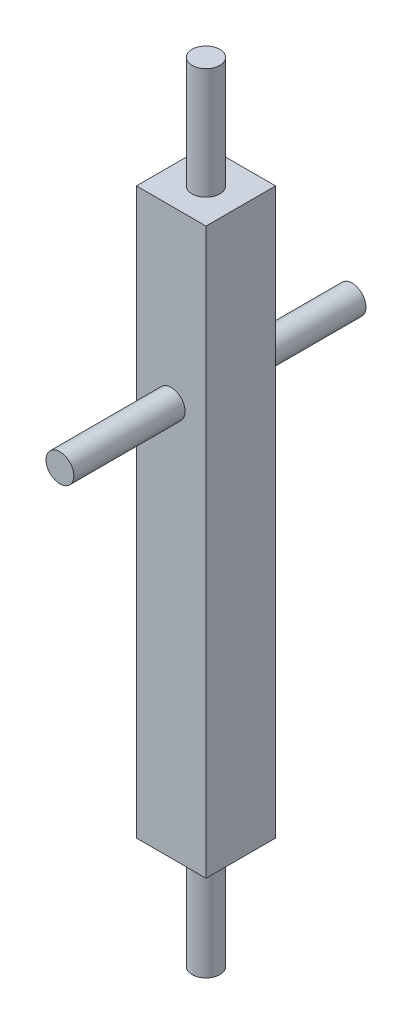
ISO-10303-21;
HEADER;
FILE_DESCRIPTION(('STEP AP214'),'2;1');
FILE_NAME('part.step','',(''),(''),'','','');
FILE_SCHEMA(('AUTOMOTIVE_DESIGN { 1 0 10303 214 1 1 1 1 }'));
ENDSEC;
DATA;
#1=APPLICATION_CONTEXT('core data for automotive mechanical design processes');
#2=APPLICATION_PROTOCOL_DEFINITION('international standard','automotive_design',2000,#1);
#3=PRODUCT_CONTEXT('',#1,'mechanical');
#4=PRODUCT('Part','Part','',(#3));
#5=PRODUCT_RELATED_PRODUCT_CATEGORY('part','',(#4));
#6=PRODUCT_DEFINITION_FORMATION('','',#4);
#7=PRODUCT_DEFINITION_CONTEXT('part definition',#1,'design');
#8=PRODUCT_DEFINITION('design','',#6,#7);
#9=PRODUCT_DEFINITION_SHAPE('','',#8);
#10=(LENGTH_UNIT() NAMED_UNIT(*) SI_UNIT(.MILLI.,.METRE.));
#11=(NAMED_UNIT(*) PLANE_ANGLE_UNIT() SI_UNIT($,.RADIAN.));
#12=(NAMED_UNIT(*) SI_UNIT($,.STERADIAN.) SOLID_ANGLE_UNIT());
#13=UNCERTAINTY_MEASURE_WITH_UNIT(LENGTH_MEASURE(1.E-05),#10,'distance_accuracy_value','');
#14=(GEOMETRIC_REPRESENTATION_CONTEXT(3) GLOBAL_UNCERTAINTY_ASSIGNED_CONTEXT((#13)) GLOBAL_UNIT_ASSIGNED_CONTEXT((#10,
#11,#12)) REPRESENTATION_CONTEXT('',''));
#15=CARTESIAN_POINT('',(0.,0.,0.));
#16=DIRECTION('',(0.,0.,1.));
#17=DIRECTION('',(1.,0.,0.));
#18=AXIS2_PLACEMENT_3D('',#15,#16,#17);
#19=CARTESIAN_POINT('',(12.5,200.,-12.5));
#20=DIRECTION('',(-1.,0.,0.));
#21=DIRECTION('',(0.,0.,1.));
#22=AXIS2_PLACEMENT_3D('',#19,#20,#21);
#23=PLANE('',#22);
#24=DIRECTION('',(0.,-1.,0.));
#25=VECTOR('',#24,1.);
#26=CARTESIAN_POINT('',(12.5,200.,12.5));
#27=LINE('',#26,#25);
#28=CARTESIAN_POINT('',(12.5,201.5,12.5));
#29=VERTEX_POINT('',#28);
#30=CARTESIAN_POINT('',(12.5,-1.5,12.5));
#31=VERTEX_POINT('',#30);
#32=EDGE_CURVE('E102',#29,#31,#27,.T.);
#33=ORIENTED_EDGE('',*,*,#32,.T.);
#34=DIRECTION('',(0.,0.,1.));
#35=VECTOR('',#34,1.);
#36=CARTESIAN_POINT('',(12.5,-1.5,12.5));
#37=LINE('',#36,#35);
#38=CARTESIAN_POINT('',(12.5,-1.5,-12.5));
#39=VERTEX_POINT('',#38);
#40=EDGE_CURVE('E105',#39,#31,#37,.T.);
#41=ORIENTED_EDGE('',*,*,#40,.F.);
#42=DIRECTION('',(0.,-1.,0.));
#43=VECTOR('',#42,1.);
#44=CARTESIAN_POINT('',(12.5,200.,-12.5));
#45=LINE('',#44,#43);
#46=CARTESIAN_POINT('',(12.5,201.5,-12.5));
#47=VERTEX_POINT('',#46);
#48=EDGE_CURVE('E189',#47,#39,#45,.T.);
#49=ORIENTED_EDGE('',*,*,#48,.F.);
#50=DIRECTION('',(0.,0.,-1.));
#51=VECTOR('',#50,1.);
#52=CARTESIAN_POINT('',(12.5,201.5,-12.5));
#53=LINE('',#52,#51);
#54=EDGE_CURVE('E107',#29,#47,#53,.T.);
#55=ORIENTED_EDGE('',*,*,#54,.F.);
#56=EDGE_LOOP('',(#33,#41,#49,#55));
#57=FACE_BOUND('',#56,.T.);
#58=ADVANCED_FACE('F34',(#57),#23,.F.);
#59=CARTESIAN_POINT('',(-12.5,200.,-12.5));
#60=DIRECTION('',(0.,0.,1.));
#61=DIRECTION('',(1.,0.,0.));
#62=AXIS2_PLACEMENT_3D('',#59,#60,#61);
#63=PLANE('',#62);
#64=CARTESIAN_POINT('',(0.,140.,-12.5));
#65=DIRECTION('',(0.,0.,1.));
#66=DIRECTION('',(1.,0.,0.));
#67=AXIS2_PLACEMENT_3D('',#64,#65,#66);
#68=CIRCLE('',#67,5.00000000000001);
#69=CARTESIAN_POINT('',(5.00000000000001,140.,-12.5));
#70=VERTEX_POINT('',#69);
#71=EDGE_CURVE('E150',#70,#70,#68,.T.);
#72=ORIENTED_EDGE('',*,*,#71,.T.);
#73=EDGE_LOOP('',(#72));
#74=FACE_BOUND('',#73,.T.);
#75=ORIENTED_EDGE('',*,*,#48,.T.);
#76=DIRECTION('',(1.,0.,0.));
#77=VECTOR('',#76,1.);
#78=CARTESIAN_POINT('',(-12.5,-1.5,-12.5));
#79=LINE('',#78,#77);
#80=CARTESIAN_POINT('',(-12.5,-1.5,-12.5));
#81=VERTEX_POINT('',#80);
#82=EDGE_CURVE('E125',#81,#39,#79,.T.);
#83=ORIENTED_EDGE('',*,*,#82,.F.);
#84=DIRECTION('',(0.,-1.,0.));
#85=VECTOR('',#84,1.);
#86=CARTESIAN_POINT('',(-12.5,200.,-12.5));
#87=LINE('',#86,#85);
#88=CARTESIAN_POINT('',(-12.5,201.5,-12.5));
#89=VERTEX_POINT('',#88);
#90=EDGE_CURVE('E188',#89,#81,#87,.T.);
#91=ORIENTED_EDGE('',*,*,#90,.F.);
#92=DIRECTION('',(-1.,0.,0.));
#93=VECTOR('',#92,1.);
#94=CARTESIAN_POINT('',(-12.5,201.5,-12.5));
#95=LINE('',#94,#93);
#96=EDGE_CURVE('E136',#47,#89,#95,.T.);
#97=ORIENTED_EDGE('',*,*,#96,.F.);
#98=EDGE_LOOP('',(#75,#83,#91,#97));
#99=FACE_BOUND('',#98,.T.);
#100=ADVANCED_FACE('F212',(#74,#99),#63,.F.);
#101=CARTESIAN_POINT('',(-12.5,200.,-12.5));
#102=DIRECTION('',(1.,0.,0.));
#103=DIRECTION('',(0.,0.,-1.));
#104=AXIS2_PLACEMENT_3D('',#101,#102,#103);
#105=PLANE('',#104);
#106=ORIENTED_EDGE('',*,*,#90,.T.);
#107=DIRECTION('',(0.,0.,-1.));
#108=VECTOR('',#107,1.);
#109=CARTESIAN_POINT('',(-12.5,-1.5,12.5));
#110=LINE('',#109,#108);
#111=CARTESIAN_POINT('',(-12.5,-1.5,12.5));
#112=VERTEX_POINT('',#111);
#113=EDGE_CURVE('E120',#112,#81,#110,.T.);
#114=ORIENTED_EDGE('',*,*,#113,.F.);
#115=DIRECTION('',(0.,-1.,0.));
#116=VECTOR('',#115,1.);
#117=CARTESIAN_POINT('',(-12.5,200.,12.5));
#118=LINE('',#117,#116);
#119=CARTESIAN_POINT('',(-12.5,201.5,12.5));
#120=VERTEX_POINT('',#119);
#121=EDGE_CURVE('E111',#120,#112,#118,.T.);
#122=ORIENTED_EDGE('',*,*,#121,.F.);
#123=DIRECTION('',(0.,0.,1.));
#124=VECTOR('',#123,1.);
#125=CARTESIAN_POINT('',(-12.5,201.5,-12.5));
#126=LINE('',#125,#124);
#127=EDGE_CURVE('E139',#89,#120,#126,.T.);
#128=ORIENTED_EDGE('',*,*,#127,.F.);
#129=EDGE_LOOP('',(#106,#114,#122,#128));
#130=FACE_BOUND('',#129,.T.);
#131=ADVANCED_FACE('F217',(#130),#105,.F.);
#132=CARTESIAN_POINT('',(-12.5,200.,12.5));
#133=DIRECTION('',(0.,0.,-1.));
#134=DIRECTION('',(-1.,0.,0.));
#135=AXIS2_PLACEMENT_3D('',#132,#133,#134);
#136=PLANE('',#135);
#137=CARTESIAN_POINT('',(0.,140.,12.5));
#138=DIRECTION('',(0.,0.,1.));
#139=DIRECTION('',(1.,0.,0.));
#140=AXIS2_PLACEMENT_3D('',#137,#138,#139);
#141=CIRCLE('',#140,5.);
#142=CARTESIAN_POINT('',(5.,140.,12.5));
#143=VERTEX_POINT('',#142);
#144=EDGE_CURVE('E153',#143,#143,#141,.T.);
#145=ORIENTED_EDGE('',*,*,#144,.F.);
#146=EDGE_LOOP('',(#145));
#147=FACE_BOUND('',#146,.T.);
#148=ORIENTED_EDGE('',*,*,#121,.T.);
#149=DIRECTION('',(-1.,0.,0.));
#150=VECTOR('',#149,1.);
#151=CARTESIAN_POINT('',(-12.5,-1.5,12.5));
#152=LINE('',#151,#150);
#153=EDGE_CURVE('E115',#31,#112,#152,.T.);
#154=ORIENTED_EDGE('',*,*,#153,.F.);
#155=ORIENTED_EDGE('',*,*,#32,.F.);
#156=DIRECTION('',(1.,0.,0.));
#157=VECTOR('',#156,1.);
#158=CARTESIAN_POINT('',(-12.5,201.5,12.5));
#159=LINE('',#158,#157);
#160=EDGE_CURVE('E142',#120,#29,#159,.T.);
#161=ORIENTED_EDGE('',*,*,#160,.F.);
#162=EDGE_LOOP('',(#148,#154,#155,#161));
#163=FACE_BOUND('',#162,.T.);
#164=ADVANCED_FACE('F116',(#147,#163),#136,.F.);
#165=CARTESIAN_POINT('',(0.,140.,52.5));
#166=DIRECTION('',(0.,0.,1.));
#167=DIRECTION('',(1.,0.,0.));
#168=AXIS2_PLACEMENT_3D('',#165,#166,#167);
#169=PLANE('',#168);
#170=CARTESIAN_POINT('',(0.,140.,52.5));
#171=DIRECTION('',(0.,0.,1.));
#172=DIRECTION('',(1.,0.,0.));
#173=AXIS2_PLACEMENT_3D('',#170,#171,#172);
#174=CIRCLE('',#173,5.00000000000001);
#175=CARTESIAN_POINT('',(5.00000000000001,140.,52.5));
#176=VERTEX_POINT('',#175);
#177=EDGE_CURVE('E144',#176,#176,#174,.T.);
#178=ORIENTED_EDGE('',*,*,#177,.T.);
#179=EDGE_LOOP('',(#178));
#180=FACE_BOUND('',#179,.T.);
#181=ADVANCED_FACE('F227',(#180),#169,.T.);
#182=CARTESIAN_POINT('',(0.,140.,-52.5));
#183=DIRECTION('',(0.,0.,1.));
#184=DIRECTION('',(1.,0.,0.));
#185=AXIS2_PLACEMENT_3D('',#182,#183,#184);
#186=CYLINDRICAL_SURFACE('',#185,5.00000000000001);
#187=ORIENTED_EDGE('',*,*,#177,.F.);
#188=EDGE_LOOP('',(#187));
#189=FACE_BOUND('',#188,.T.);
#190=ORIENTED_EDGE('',*,*,#144,.T.);
#191=EDGE_LOOP('',(#190));
#192=FACE_BOUND('',#191,.T.);
#193=ADVANCED_FACE('F251',(#189,#192),#186,.T.);
#194=CARTESIAN_POINT('',(0.,140.,-52.5));
#195=DIRECTION('',(0.,0.,1.));
#196=DIRECTION('',(1.,0.,0.));
#197=AXIS2_PLACEMENT_3D('',#194,#195,#196);
#198=CIRCLE('',#197,5.00000000000001);
#199=CARTESIAN_POINT('',(5.00000000000001,140.,-52.5));
#200=VERTEX_POINT('',#199);
#201=EDGE_CURVE('E147',#200,#200,#198,.T.);
#202=ORIENTED_EDGE('',*,*,#201,.T.);
#203=EDGE_LOOP('',(#202));
#204=FACE_BOUND('',#203,.T.);
#205=ORIENTED_EDGE('',*,*,#71,.F.);
#206=EDGE_LOOP('',(#205));
#207=FACE_BOUND('',#206,.T.);
#208=ADVANCED_FACE('F250',(#204,#207),#186,.T.);
#209=CARTESIAN_POINT('',(0.,140.,-52.5));
#210=DIRECTION('',(0.,0.,1.));
#211=DIRECTION('',(1.,0.,0.));
#212=AXIS2_PLACEMENT_3D('',#209,#210,#211);
#213=PLANE('',#212);
#214=ORIENTED_EDGE('',*,*,#201,.F.);
#215=EDGE_LOOP('',(#214));
#216=FACE_BOUND('',#215,.T.);
#217=ADVANCED_FACE('F207',(#216),#213,.F.);
#218=CARTESIAN_POINT('',(0.,201.5,0.));
#219=DIRECTION('',(0.,1.,0.));
#220=DIRECTION('',(0.,0.,1.));
#221=AXIS2_PLACEMENT_3D('',#218,#219,#220);
#222=PLANE('',#221);
#223=CARTESIAN_POINT('',(0.,201.5,0.));
#224=DIRECTION('',(0.,1.,0.));
#225=DIRECTION('',(0.,0.,1.));
#226=AXIS2_PLACEMENT_3D('',#223,#224,#225);
#227=CIRCLE('',#226,5.);
#228=CARTESIAN_POINT('',(0.,201.5,5.));
#229=VERTEX_POINT('',#228);
#230=EDGE_CURVE('E11',#229,#229,#227,.T.);
#231=ORIENTED_EDGE('',*,*,#230,.F.);
#232=EDGE_LOOP('',(#231));
#233=FACE_BOUND('',#232,.T.);
#234=ORIENTED_EDGE('',*,*,#54,.T.);
#235=ORIENTED_EDGE('',*,*,#96,.T.);
#236=ORIENTED_EDGE('',*,*,#127,.T.);
#237=ORIENTED_EDGE('',*,*,#160,.T.);
#238=EDGE_LOOP('',(#234,#235,#236,#237));
#239=FACE_BOUND('',#238,.T.);
#240=ADVANCED_FACE('F198',(#233,#239),#222,.T.);
#241=CARTESIAN_POINT('',(0.,-1.5,0.));
#242=DIRECTION('',(0.,-1.,0.));
#243=DIRECTION('',(0.,0.,-1.));
#244=AXIS2_PLACEMENT_3D('',#241,#242,#243);
#245=PLANE('',#244);
#246=CARTESIAN_POINT('',(0.,-1.5,0.));
#247=DIRECTION('',(0.,-1.,0.));
#248=DIRECTION('',(0.,0.,-1.));
#249=AXIS2_PLACEMENT_3D('',#246,#247,#248);
#250=CIRCLE('',#249,5.);
#251=CARTESIAN_POINT('',(0.,-1.5,-5.));
#252=VERTEX_POINT('',#251);
#253=EDGE_CURVE('E43',#252,#252,#250,.T.);
#254=ORIENTED_EDGE('',*,*,#253,.F.);
#255=EDGE_LOOP('',(#254));
#256=FACE_BOUND('',#255,.T.);
#257=ORIENTED_EDGE('',*,*,#40,.T.);
#258=ORIENTED_EDGE('',*,*,#153,.T.);
#259=ORIENTED_EDGE('',*,*,#113,.T.);
#260=ORIENTED_EDGE('',*,*,#82,.T.);
#261=EDGE_LOOP('',(#257,#258,#259,#260));
#262=FACE_BOUND('',#261,.T.);
#263=ADVANCED_FACE('F123',(#256,#262),#245,.T.);
#264=CARTESIAN_POINT('',(0.,-41.5,0.));
#265=DIRECTION('',(0.,1.,0.));
#266=DIRECTION('',(0.,0.,1.));
#267=AXIS2_PLACEMENT_3D('',#264,#265,#266);
#268=CYLINDRICAL_SURFACE('',#267,5.);
#269=CARTESIAN_POINT('',(0.,-41.5,0.));
#270=DIRECTION('',(0.,-1.,0.));
#271=DIRECTION('',(0.,0.,-1.));
#272=AXIS2_PLACEMENT_3D('',#269,#270,#271);
#273=CIRCLE('',#272,5.);
#274=CARTESIAN_POINT('',(0.,-41.5,-5.));
#275=VERTEX_POINT('',#274);
#276=EDGE_CURVE('E126',#275,#275,#273,.T.);
#277=ORIENTED_EDGE('',*,*,#276,.F.);
#278=EDGE_LOOP('',(#277));
#279=FACE_BOUND('',#278,.T.);
#280=ORIENTED_EDGE('',*,*,#253,.T.);
#281=EDGE_LOOP('',(#280));
#282=FACE_BOUND('',#281,.T.);
#283=ADVANCED_FACE('F195',(#279,#282),#268,.T.);
#284=CARTESIAN_POINT('',(0.,-41.5,0.));
#285=DIRECTION('',(0.,-1.,0.));
#286=DIRECTION('',(0.,0.,-1.));
#287=AXIS2_PLACEMENT_3D('',#284,#285,#286);
#288=PLANE('',#287);
#289=ORIENTED_EDGE('',*,*,#276,.T.);
#290=EDGE_LOOP('',(#289));
#291=FACE_BOUND('',#290,.T.);
#292=ADVANCED_FACE('F204',(#291),#288,.T.);
#293=CARTESIAN_POINT('',(0.,241.5,0.));
#294=DIRECTION('',(0.,-1.,0.));
#295=DIRECTION('',(0.,0.,-1.));
#296=AXIS2_PLACEMENT_3D('',#293,#294,#295);
#297=CYLINDRICAL_SURFACE('',#296,5.);
#298=CARTESIAN_POINT('',(0.,241.5,0.));
#299=DIRECTION('',(0.,1.,0.));
#300=DIRECTION('',(0.,0.,1.));
#301=AXIS2_PLACEMENT_3D('',#298,#299,#300);
#302=CIRCLE('',#301,5.);
#303=CARTESIAN_POINT('',(0.,241.5,5.));
#304=VERTEX_POINT('',#303);
#305=EDGE_CURVE('E129',#304,#304,#302,.T.);
#306=ORIENTED_EDGE('',*,*,#305,.F.);
#307=EDGE_LOOP('',(#306));
#308=FACE_BOUND('',#307,.T.);
#309=ORIENTED_EDGE('',*,*,#230,.T.);
#310=EDGE_LOOP('',(#309));
#311=FACE_BOUND('',#310,.T.);
#312=ADVANCED_FACE('F323',(#308,#311),#297,.T.);
#313=CARTESIAN_POINT('',(0.,241.5,0.));
#314=DIRECTION('',(0.,1.,0.));
#315=DIRECTION('',(0.,0.,1.));
#316=AXIS2_PLACEMENT_3D('',#313,#314,#315);
#317=PLANE('',#316);
#318=ORIENTED_EDGE('',*,*,#305,.T.);
#319=EDGE_LOOP('',(#318));
#320=FACE_BOUND('',#319,.T.);
#321=ADVANCED_FACE('F273',(#320),#317,.T.);
#322=CLOSED_SHELL('',(#58,#100,#131,#164,#181,#193,#208,#217,#240,#263,#283,#292,#312,#321));
#323=CARTESIAN_POINT('',(0.,0.,0.));
#324=DIRECTION('',(0.,-1.,0.));
#325=DIRECTION('',(0.,0.,-1.));
#326=AXIS2_PLACEMENT_3D('',#323,#324,#325);
#327=PLANE('',#326);
#328=DIRECTION('',(1.,0.,0.));
#329=VECTOR('',#328,1.);
#330=CARTESIAN_POINT('',(-11.,0.,11.));
#331=LINE('',#330,#329);
#332=CARTESIAN_POINT('',(-11.,0.,11.));
#333=VERTEX_POINT('',#332);
#334=CARTESIAN_POINT('',(11.,0.,11.));
#335=VERTEX_POINT('',#334);
#336=EDGE_CURVE('E164',#333,#335,#331,.T.);
#337=ORIENTED_EDGE('',*,*,#336,.T.);
#338=DIRECTION('',(0.,0.,-1.));
#339=VECTOR('',#338,1.);
#340=CARTESIAN_POINT('',(11.,0.,-11.));
#341=LINE('',#340,#339);
#342=CARTESIAN_POINT('',(11.,0.,-11.));
#343=VERTEX_POINT('',#342);
#344=EDGE_CURVE('E159',#335,#343,#341,.T.);
#345=ORIENTED_EDGE('',*,*,#344,.T.);
#346=DIRECTION('',(-1.,0.,0.));
#347=VECTOR('',#346,1.);
#348=CARTESIAN_POINT('',(-11.,0.,-11.));
#349=LINE('',#348,#347);
#350=CARTESIAN_POINT('',(-11.,0.,-11.));
#351=VERTEX_POINT('',#350);
#352=EDGE_CURVE('E173',#343,#351,#349,.T.);
#353=ORIENTED_EDGE('',*,*,#352,.T.);
#354=DIRECTION('',(0.,0.,1.));
#355=VECTOR('',#354,1.);
#356=CARTESIAN_POINT('',(-11.,0.,-11.));
#357=LINE('',#356,#355);
#358=EDGE_CURVE('E176',#351,#333,#357,.T.);
#359=ORIENTED_EDGE('',*,*,#358,.T.);
#360=EDGE_LOOP('',(#337,#345,#353,#359));
#361=FACE_BOUND('',#360,.T.);
#362=ADVANCED_FACE('F258',(#361),#327,.F.);
#363=CARTESIAN_POINT('',(0.,200.,0.));
#364=DIRECTION('',(0.,1.,0.));
#365=DIRECTION('',(0.,0.,1.));
#366=AXIS2_PLACEMENT_3D('',#363,#364,#365);
#367=PLANE('',#366);
#368=DIRECTION('',(-1.,0.,0.));
#369=VECTOR('',#368,1.);
#370=CARTESIAN_POINT('',(-11.,200.,-11.));
#371=LINE('',#370,#369);
#372=CARTESIAN_POINT('',(11.,200.,-11.));
#373=VERTEX_POINT('',#372);
#374=CARTESIAN_POINT('',(-11.,200.,-11.));
#375=VERTEX_POINT('',#374);
#376=EDGE_CURVE('E163',#373,#375,#371,.T.);
#377=ORIENTED_EDGE('',*,*,#376,.F.);
#378=DIRECTION('',(0.,0.,-1.));
#379=VECTOR('',#378,1.);
#380=CARTESIAN_POINT('',(11.,200.,-11.));
#381=LINE('',#380,#379);
#382=CARTESIAN_POINT('',(11.,200.,11.));
#383=VERTEX_POINT('',#382);
#384=EDGE_CURVE('E160',#383,#373,#381,.T.);
#385=ORIENTED_EDGE('',*,*,#384,.F.);
#386=DIRECTION('',(1.,0.,0.));
#387=VECTOR('',#386,1.);
#388=CARTESIAN_POINT('',(-11.,200.,11.));
#389=LINE('',#388,#387);
#390=CARTESIAN_POINT('',(-11.,200.,11.));
#391=VERTEX_POINT('',#390);
#392=EDGE_CURVE('E51',#391,#383,#389,.T.);
#393=ORIENTED_EDGE('',*,*,#392,.F.);
#394=DIRECTION('',(0.,0.,1.));
#395=VECTOR('',#394,1.);
#396=CARTESIAN_POINT('',(-11.,200.,-11.));
#397=LINE('',#396,#395);
#398=EDGE_CURVE('E167',#375,#391,#397,.T.);
#399=ORIENTED_EDGE('',*,*,#398,.F.);
#400=EDGE_LOOP('',(#377,#385,#393,#399));
#401=FACE_BOUND('',#400,.T.);
#402=ADVANCED_FACE('F248',(#401),#367,.F.);
#403=CARTESIAN_POINT('',(0.,140.,-11.));
#404=DIRECTION('',(0.,0.,1.));
#405=DIRECTION('',(1.,0.,0.));
#406=AXIS2_PLACEMENT_3D('',#403,#404,#405);
#407=CIRCLE('',#406,5.);
#408=CARTESIAN_POINT('',(5.,140.,-11.));
#409=VERTEX_POINT('',#408);
#410=EDGE_CURVE('E156',#409,#409,#407,.T.);
#411=ORIENTED_EDGE('',*,*,#410,.T.);
#412=EDGE_LOOP('',(#411));
#413=FACE_BOUND('',#412,.T.);
#414=CARTESIAN_POINT('',(0.,140.,11.));
#415=DIRECTION('',(0.,0.,-1.));
#416=DIRECTION('',(-1.,0.,0.));
#417=AXIS2_PLACEMENT_3D('',#414,#415,#416);
#418=CIRCLE('',#417,5.);
#419=CARTESIAN_POINT('',(-5.,140.,11.));
#420=VERTEX_POINT('',#419);
#421=EDGE_CURVE('E37',#420,#420,#418,.T.);
#422=ORIENTED_EDGE('',*,*,#421,.T.);
#423=EDGE_LOOP('',(#422));
#424=FACE_BOUND('',#423,.T.);
#425=ADVANCED_FACE('F244',(#413,#424),#186,.T.);
#426=CARTESIAN_POINT('',(-11.,200.,11.));
#427=DIRECTION('',(0.,0.,-1.));
#428=DIRECTION('',(-1.,0.,0.));
#429=AXIS2_PLACEMENT_3D('',#426,#427,#428);
#430=PLANE('',#429);
#431=ORIENTED_EDGE('',*,*,#421,.F.);
#432=EDGE_LOOP('',(#431));
#433=FACE_BOUND('',#432,.T.);
#434=ORIENTED_EDGE('',*,*,#336,.F.);
#435=DIRECTION('',(0.,-1.,0.));
#436=VECTOR('',#435,1.);
#437=CARTESIAN_POINT('',(-11.,200.,11.));
#438=LINE('',#437,#436);
#439=EDGE_CURVE('E58',#391,#333,#438,.T.);
#440=ORIENTED_EDGE('',*,*,#439,.F.);
#441=ORIENTED_EDGE('',*,*,#392,.T.);
#442=DIRECTION('',(0.,-1.,0.));
#443=VECTOR('',#442,1.);
#444=CARTESIAN_POINT('',(11.,200.,11.));
#445=LINE('',#444,#443);
#446=EDGE_CURVE('E170',#383,#335,#445,.T.);
#447=ORIENTED_EDGE('',*,*,#446,.T.);
#448=EDGE_LOOP('',(#434,#440,#441,#447));
#449=FACE_BOUND('',#448,.T.);
#450=ADVANCED_FACE('F241',(#433,#449),#430,.T.);
#451=CARTESIAN_POINT('',(-11.,200.,-11.));
#452=DIRECTION('',(1.,0.,0.));
#453=DIRECTION('',(0.,0.,-1.));
#454=AXIS2_PLACEMENT_3D('',#451,#452,#453);
#455=PLANE('',#454);
#456=ORIENTED_EDGE('',*,*,#358,.F.);
#457=DIRECTION('',(0.,-1.,0.));
#458=VECTOR('',#457,1.);
#459=CARTESIAN_POINT('',(-11.,200.,-11.));
#460=LINE('',#459,#458);
#461=EDGE_CURVE('E183',#375,#351,#460,.T.);
#462=ORIENTED_EDGE('',*,*,#461,.F.);
#463=ORIENTED_EDGE('',*,*,#398,.T.);
#464=ORIENTED_EDGE('',*,*,#439,.T.);
#465=EDGE_LOOP('',(#456,#462,#463,#464));
#466=FACE_BOUND('',#465,.T.);
#467=ADVANCED_FACE('F237',(#466),#455,.T.);
#468=CARTESIAN_POINT('',(-11.,200.,-11.));
#469=DIRECTION('',(0.,0.,1.));
#470=DIRECTION('',(1.,0.,0.));
#471=AXIS2_PLACEMENT_3D('',#468,#469,#470);
#472=PLANE('',#471);
#473=ORIENTED_EDGE('',*,*,#410,.F.);
#474=EDGE_LOOP('',(#473));
#475=FACE_BOUND('',#474,.T.);
#476=ORIENTED_EDGE('',*,*,#352,.F.);
#477=DIRECTION('',(0.,-1.,0.));
#478=VECTOR('',#477,1.);
#479=CARTESIAN_POINT('',(11.,200.,-11.));
#480=LINE('',#479,#478);
#481=EDGE_CURVE('E112',#373,#343,#480,.T.);
#482=ORIENTED_EDGE('',*,*,#481,.F.);
#483=ORIENTED_EDGE('',*,*,#376,.T.);
#484=ORIENTED_EDGE('',*,*,#461,.T.);
#485=EDGE_LOOP('',(#476,#482,#483,#484));
#486=FACE_BOUND('',#485,.T.);
#487=ADVANCED_FACE('F232',(#475,#486),#472,.T.);
#488=CARTESIAN_POINT('',(11.,200.,-11.));
#489=DIRECTION('',(-1.,0.,0.));
#490=DIRECTION('',(0.,0.,1.));
#491=AXIS2_PLACEMENT_3D('',#488,#489,#490);
#492=PLANE('',#491);
#493=ORIENTED_EDGE('',*,*,#344,.F.);
#494=ORIENTED_EDGE('',*,*,#446,.F.);
#495=ORIENTED_EDGE('',*,*,#384,.T.);
#496=ORIENTED_EDGE('',*,*,#481,.T.);
#497=EDGE_LOOP('',(#493,#494,#495,#496));
#498=FACE_BOUND('',#497,.T.);
#499=ADVANCED_FACE('F229',(#498),#492,.T.);
#500=CLOSED_SHELL('',(#362,#402,#425,#450,#467,#487,#499));
#501=ORIENTED_CLOSED_SHELL('',*,#500,.T.);
#502=BREP_WITH_VOIDS('B2',#322,(#501));
#503=ADVANCED_BREP_SHAPE_REPRESENTATION('',(#18,#502),#14);
#504=SHAPE_DEFINITION_REPRESENTATION(#9,#503);
ENDSEC;
END-ISO-10303-21;
